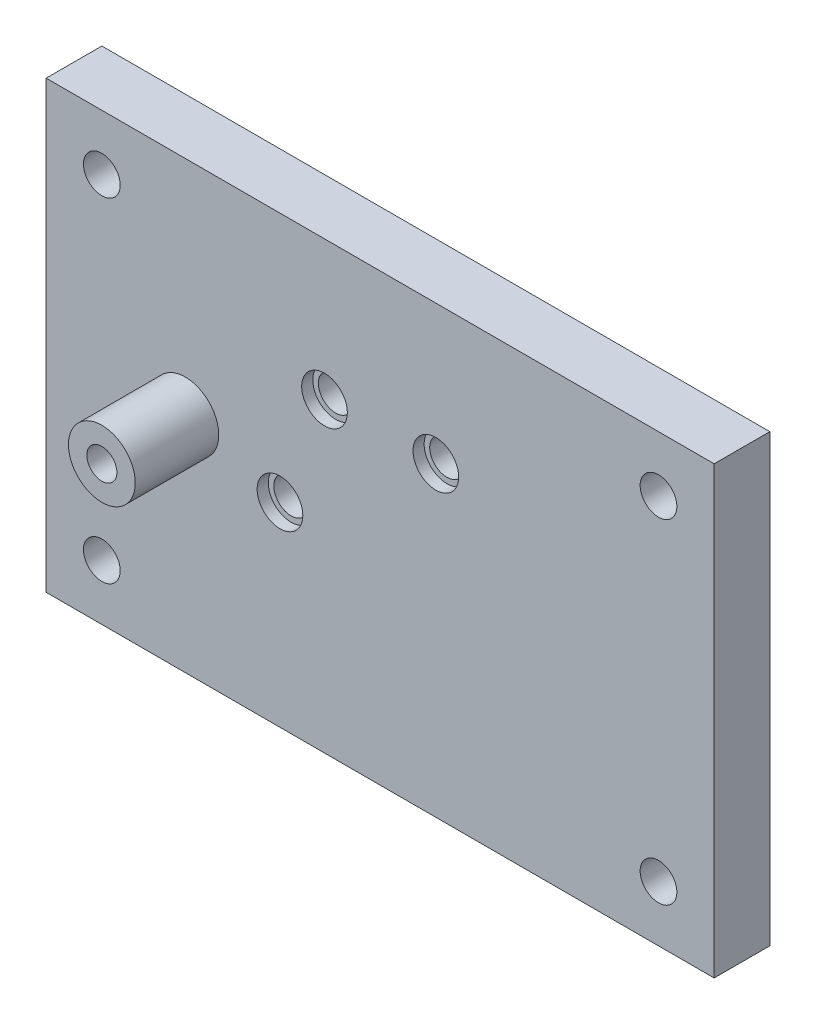
ISO-10303-21;
HEADER;
FILE_DESCRIPTION(('STEP AP214'),'2;1');
FILE_NAME('part.step','',(''),(''),'','','');
FILE_SCHEMA(('AUTOMOTIVE_DESIGN { 1 0 10303 214 1 1 1 1 }'));
ENDSEC;
DATA;
#1=APPLICATION_CONTEXT('core data for automotive mechanical design processes');
#2=APPLICATION_PROTOCOL_DEFINITION('international standard','automotive_design',2000,#1);
#3=PRODUCT_CONTEXT('',#1,'mechanical');
#4=PRODUCT('Part','Part','',(#3));
#5=PRODUCT_RELATED_PRODUCT_CATEGORY('part','',(#4));
#6=PRODUCT_DEFINITION_FORMATION('','',#4);
#7=PRODUCT_DEFINITION_CONTEXT('part definition',#1,'design');
#8=PRODUCT_DEFINITION('design','',#6,#7);
#9=PRODUCT_DEFINITION_SHAPE('','',#8);
#10=(LENGTH_UNIT() NAMED_UNIT(*) SI_UNIT(.MILLI.,.METRE.));
#11=(NAMED_UNIT(*) PLANE_ANGLE_UNIT() SI_UNIT($,.RADIAN.));
#12=(NAMED_UNIT(*) SI_UNIT($,.STERADIAN.) SOLID_ANGLE_UNIT());
#13=UNCERTAINTY_MEASURE_WITH_UNIT(LENGTH_MEASURE(1.E-05),#10,'distance_accuracy_value','');
#14=(GEOMETRIC_REPRESENTATION_CONTEXT(3) GLOBAL_UNCERTAINTY_ASSIGNED_CONTEXT((#13)) GLOBAL_UNIT_ASSIGNED_CONTEXT((#10,
#11,#12)) REPRESENTATION_CONTEXT('',''));
#15=CARTESIAN_POINT('',(0.,0.,0.));
#16=DIRECTION('',(0.,0.,1.));
#17=DIRECTION('',(1.,0.,0.));
#18=AXIS2_PLACEMENT_3D('',#15,#16,#17);
#19=CARTESIAN_POINT('',(-18.,-5.,10.));
#20=DIRECTION('',(0.,0.,-1.));
#21=DIRECTION('',(-1.,0.,0.));
#22=AXIS2_PLACEMENT_3D('',#19,#20,#21);
#23=CYLINDRICAL_SURFACE('',#22,3.1);
#24=CARTESIAN_POINT('',(-18.,-5.,0.));
#25=DIRECTION('',(0.,0.,1.));
#26=DIRECTION('',(1.,0.,0.));
#27=AXIS2_PLACEMENT_3D('',#24,#25,#26);
#28=CIRCLE('',#27,3.1);
#29=CARTESIAN_POINT('',(-14.9,-5.,0.));
#30=VERTEX_POINT('',#29);
#31=EDGE_CURVE('E120',#30,#30,#28,.T.);
#32=ORIENTED_EDGE('',*,*,#31,.F.);
#33=EDGE_LOOP('',(#32));
#34=FACE_BOUND('',#33,.T.);
#35=CARTESIAN_POINT('',(-18.,-5.,8.));
#36=DIRECTION('',(0.,0.,1.));
#37=DIRECTION('',(1.,0.,0.));
#38=AXIS2_PLACEMENT_3D('',#35,#36,#37);
#39=CIRCLE('',#38,3.1);
#40=CARTESIAN_POINT('',(-14.9,-5.,8.));
#41=VERTEX_POINT('',#40);
#42=EDGE_CURVE('E43',#41,#41,#39,.T.);
#43=ORIENTED_EDGE('',*,*,#42,.T.);
#44=EDGE_LOOP('',(#43));
#45=FACE_BOUND('',#44,.T.);
#46=ADVANCED_FACE('F39',(#34,#45),#23,.F.);
#47=CARTESIAN_POINT('',(10.,15.,10.));
#48=DIRECTION('',(0.,0.,-1.));
#49=DIRECTION('',(-1.,0.,0.));
#50=AXIS2_PLACEMENT_3D('',#47,#48,#49);
#51=CYLINDRICAL_SURFACE('',#50,3.1);
#52=CARTESIAN_POINT('',(10.,15.,0.));
#53=DIRECTION('',(0.,0.,1.));
#54=DIRECTION('',(1.,0.,0.));
#55=AXIS2_PLACEMENT_3D('',#52,#53,#54);
#56=CIRCLE('',#55,3.1);
#57=CARTESIAN_POINT('',(13.1,15.,0.));
#58=VERTEX_POINT('',#57);
#59=EDGE_CURVE('E145',#58,#58,#56,.T.);
#60=ORIENTED_EDGE('',*,*,#59,.F.);
#61=EDGE_LOOP('',(#60));
#62=FACE_BOUND('',#61,.T.);
#63=CARTESIAN_POINT('',(10.,15.,8.));
#64=DIRECTION('',(0.,0.,1.));
#65=DIRECTION('',(1.,0.,0.));
#66=AXIS2_PLACEMENT_3D('',#63,#64,#65);
#67=CIRCLE('',#66,3.1);
#68=CARTESIAN_POINT('',(13.1,15.,8.));
#69=VERTEX_POINT('',#68);
#70=EDGE_CURVE('E122',#69,#69,#67,.T.);
#71=ORIENTED_EDGE('',*,*,#70,.T.);
#72=EDGE_LOOP('',(#71));
#73=FACE_BOUND('',#72,.T.);
#74=ADVANCED_FACE('F184',(#62,#73),#51,.F.);
#75=CARTESIAN_POINT('',(-10.,15.,10.));
#76=DIRECTION('',(0.,0.,-1.));
#77=DIRECTION('',(-1.,0.,0.));
#78=AXIS2_PLACEMENT_3D('',#75,#76,#77);
#79=CYLINDRICAL_SURFACE('',#78,3.1);
#80=CARTESIAN_POINT('',(-10.,15.,0.));
#81=DIRECTION('',(0.,0.,1.));
#82=DIRECTION('',(1.,0.,0.));
#83=AXIS2_PLACEMENT_3D('',#80,#81,#82);
#84=CIRCLE('',#83,3.1);
#85=CARTESIAN_POINT('',(-6.9,15.,0.));
#86=VERTEX_POINT('',#85);
#87=EDGE_CURVE('E148',#86,#86,#84,.T.);
#88=ORIENTED_EDGE('',*,*,#87,.F.);
#89=EDGE_LOOP('',(#88));
#90=FACE_BOUND('',#89,.T.);
#91=CARTESIAN_POINT('',(-10.,15.,8.));
#92=DIRECTION('',(0.,0.,1.));
#93=DIRECTION('',(1.,0.,0.));
#94=AXIS2_PLACEMENT_3D('',#91,#92,#93);
#95=CIRCLE('',#94,3.1);
#96=CARTESIAN_POINT('',(-6.9,15.,8.));
#97=VERTEX_POINT('',#96);
#98=EDGE_CURVE('E118',#97,#97,#95,.T.);
#99=ORIENTED_EDGE('',*,*,#98,.T.);
#100=EDGE_LOOP('',(#99));
#101=FACE_BOUND('',#100,.T.);
#102=ADVANCED_FACE('F192',(#90,#101),#79,.F.);
#103=CARTESIAN_POINT('',(-60.,-40.,10.));
#104=DIRECTION('',(1.,0.,0.));
#105=DIRECTION('',(0.,0.,-1.));
#106=AXIS2_PLACEMENT_3D('',#103,#104,#105);
#107=PLANE('',#106);
#108=DIRECTION('',(0.,-1.,0.));
#109=VECTOR('',#108,1.);
#110=CARTESIAN_POINT('',(-60.,-40.,0.));
#111=LINE('',#110,#109);
#112=CARTESIAN_POINT('',(-60.,40.,0.));
#113=VERTEX_POINT('',#112);
#114=CARTESIAN_POINT('',(-60.,-40.,0.));
#115=VERTEX_POINT('',#114);
#116=EDGE_CURVE('E108',#113,#115,#111,.T.);
#117=ORIENTED_EDGE('',*,*,#116,.T.);
#118=DIRECTION('',(0.,0.,-1.));
#119=VECTOR('',#118,1.);
#120=CARTESIAN_POINT('',(-60.,-40.,10.));
#121=LINE('',#120,#119);
#122=CARTESIAN_POINT('',(-60.,-40.,10.));
#123=VERTEX_POINT('',#122);
#124=EDGE_CURVE('E49',#123,#115,#121,.T.);
#125=ORIENTED_EDGE('',*,*,#124,.F.);
#126=DIRECTION('',(0.,-1.,0.));
#127=VECTOR('',#126,1.);
#128=CARTESIAN_POINT('',(-60.,-40.,10.));
#129=LINE('',#128,#127);
#130=CARTESIAN_POINT('',(-60.,40.,10.));
#131=VERTEX_POINT('',#130);
#132=EDGE_CURVE('E94',#131,#123,#129,.T.);
#133=ORIENTED_EDGE('',*,*,#132,.F.);
#134=DIRECTION('',(0.,0.,-1.));
#135=VECTOR('',#134,1.);
#136=CARTESIAN_POINT('',(-60.,40.,10.));
#137=LINE('',#136,#135);
#138=EDGE_CURVE('E104',#131,#113,#137,.T.);
#139=ORIENTED_EDGE('',*,*,#138,.T.);
#140=EDGE_LOOP('',(#117,#125,#133,#139));
#141=FACE_BOUND('',#140,.T.);
#142=ADVANCED_FACE('F41',(#141),#107,.F.);
#143=CARTESIAN_POINT('',(-60.,-40.,10.));
#144=DIRECTION('',(0.,1.,0.));
#145=DIRECTION('',(0.,0.,1.));
#146=AXIS2_PLACEMENT_3D('',#143,#144,#145);
#147=PLANE('',#146);
#148=DIRECTION('',(1.,0.,0.));
#149=VECTOR('',#148,1.);
#150=CARTESIAN_POINT('',(-60.,-40.,0.));
#151=LINE('',#150,#149);
#152=CARTESIAN_POINT('',(60.,-40.,0.));
#153=VERTEX_POINT('',#152);
#154=EDGE_CURVE('E99',#115,#153,#151,.T.);
#155=ORIENTED_EDGE('',*,*,#154,.T.);
#156=DIRECTION('',(0.,0.,-1.));
#157=VECTOR('',#156,1.);
#158=CARTESIAN_POINT('',(60.,-40.,10.));
#159=LINE('',#158,#157);
#160=CARTESIAN_POINT('',(60.,-40.,10.));
#161=VERTEX_POINT('',#160);
#162=EDGE_CURVE('E97',#161,#153,#159,.T.);
#163=ORIENTED_EDGE('',*,*,#162,.F.);
#164=DIRECTION('',(1.,0.,0.));
#165=VECTOR('',#164,1.);
#166=CARTESIAN_POINT('',(-60.,-40.,10.));
#167=LINE('',#166,#165);
#168=EDGE_CURVE('E89',#123,#161,#167,.T.);
#169=ORIENTED_EDGE('',*,*,#168,.F.);
#170=ORIENTED_EDGE('',*,*,#124,.T.);
#171=EDGE_LOOP('',(#155,#163,#169,#170));
#172=FACE_BOUND('',#171,.T.);
#173=ADVANCED_FACE('F98',(#172),#147,.F.);
#174=CARTESIAN_POINT('',(60.,-40.,10.));
#175=DIRECTION('',(-1.,0.,0.));
#176=DIRECTION('',(0.,0.,1.));
#177=AXIS2_PLACEMENT_3D('',#174,#175,#176);
#178=PLANE('',#177);
#179=DIRECTION('',(0.,1.,0.));
#180=VECTOR('',#179,1.);
#181=CARTESIAN_POINT('',(60.,-40.,0.));
#182=LINE('',#181,#180);
#183=CARTESIAN_POINT('',(60.,40.,0.));
#184=VERTEX_POINT('',#183);
#185=EDGE_CURVE('E75',#153,#184,#182,.T.);
#186=ORIENTED_EDGE('',*,*,#185,.T.);
#187=DIRECTION('',(0.,0.,-1.));
#188=VECTOR('',#187,1.);
#189=CARTESIAN_POINT('',(60.,40.,10.));
#190=LINE('',#189,#188);
#191=CARTESIAN_POINT('',(60.,40.,10.));
#192=VERTEX_POINT('',#191);
#193=EDGE_CURVE('E100',#192,#184,#190,.T.);
#194=ORIENTED_EDGE('',*,*,#193,.F.);
#195=DIRECTION('',(0.,1.,0.));
#196=VECTOR('',#195,1.);
#197=CARTESIAN_POINT('',(60.,-40.,10.));
#198=LINE('',#197,#196);
#199=EDGE_CURVE('E92',#161,#192,#198,.T.);
#200=ORIENTED_EDGE('',*,*,#199,.F.);
#201=ORIENTED_EDGE('',*,*,#162,.T.);
#202=EDGE_LOOP('',(#186,#194,#200,#201));
#203=FACE_BOUND('',#202,.T.);
#204=ADVANCED_FACE('F102',(#203),#178,.F.);
#205=CARTESIAN_POINT('',(-60.,40.,10.));
#206=DIRECTION('',(0.,-1.,0.));
#207=DIRECTION('',(0.,0.,-1.));
#208=AXIS2_PLACEMENT_3D('',#205,#206,#207);
#209=PLANE('',#208);
#210=DIRECTION('',(-1.,0.,0.));
#211=VECTOR('',#210,1.);
#212=CARTESIAN_POINT('',(-60.,40.,0.));
#213=LINE('',#212,#211);
#214=EDGE_CURVE('E81',#184,#113,#213,.T.);
#215=ORIENTED_EDGE('',*,*,#214,.T.);
#216=ORIENTED_EDGE('',*,*,#138,.F.);
#217=DIRECTION('',(-1.,0.,0.));
#218=VECTOR('',#217,1.);
#219=CARTESIAN_POINT('',(-60.,40.,10.));
#220=LINE('',#219,#218);
#221=EDGE_CURVE('E58',#192,#131,#220,.T.);
#222=ORIENTED_EDGE('',*,*,#221,.F.);
#223=ORIENTED_EDGE('',*,*,#193,.T.);
#224=EDGE_LOOP('',(#215,#216,#222,#223));
#225=FACE_BOUND('',#224,.T.);
#226=ADVANCED_FACE('F170',(#225),#209,.F.);
#227=CARTESIAN_POINT('',(0.,0.,10.));
#228=DIRECTION('',(0.,0.,-1.));
#229=DIRECTION('',(-1.,0.,0.));
#230=AXIS2_PLACEMENT_3D('',#227,#228,#229);
#231=PLANE('',#230);
#232=CARTESIAN_POINT('',(50.,30.,10.));
#233=DIRECTION('',(0.,0.,1.));
#234=DIRECTION('',(1.,0.,0.));
#235=AXIS2_PLACEMENT_3D('',#232,#233,#234);
#236=CIRCLE('',#235,3.3);
#237=CARTESIAN_POINT('',(53.3,30.,10.));
#238=VERTEX_POINT('',#237);
#239=EDGE_CURVE('E367',#238,#238,#236,.T.);
#240=ORIENTED_EDGE('',*,*,#239,.F.);
#241=EDGE_LOOP('',(#240));
#242=FACE_BOUND('',#241,.T.);
#243=CARTESIAN_POINT('',(50.,-30.,10.));
#244=DIRECTION('',(0.,0.,1.));
#245=DIRECTION('',(1.,0.,0.));
#246=AXIS2_PLACEMENT_3D('',#243,#244,#245);
#247=CIRCLE('',#246,3.3);
#248=CARTESIAN_POINT('',(53.3,-30.,10.));
#249=VERTEX_POINT('',#248);
#250=EDGE_CURVE('E375',#249,#249,#247,.T.);
#251=ORIENTED_EDGE('',*,*,#250,.F.);
#252=EDGE_LOOP('',(#251));
#253=FACE_BOUND('',#252,.T.);
#254=CARTESIAN_POINT('',(-50.,30.,10.));
#255=DIRECTION('',(0.,0.,1.));
#256=DIRECTION('',(1.,0.,0.));
#257=AXIS2_PLACEMENT_3D('',#254,#255,#256);
#258=CIRCLE('',#257,3.3);
#259=CARTESIAN_POINT('',(-46.7,30.,10.));
#260=VERTEX_POINT('',#259);
#261=EDGE_CURVE('E381',#260,#260,#258,.T.);
#262=ORIENTED_EDGE('',*,*,#261,.F.);
#263=EDGE_LOOP('',(#262));
#264=FACE_BOUND('',#263,.T.);
#265=CARTESIAN_POINT('',(-50.,-30.,10.));
#266=DIRECTION('',(0.,0.,1.));
#267=DIRECTION('',(1.,0.,0.));
#268=AXIS2_PLACEMENT_3D('',#265,#266,#267);
#269=CIRCLE('',#268,3.3);
#270=CARTESIAN_POINT('',(-46.7,-30.,10.));
#271=VERTEX_POINT('',#270);
#272=EDGE_CURVE('E387',#271,#271,#269,.T.);
#273=ORIENTED_EDGE('',*,*,#272,.F.);
#274=EDGE_LOOP('',(#273));
#275=FACE_BOUND('',#274,.T.);
#276=CARTESIAN_POINT('',(-18.,-5.,10.));
#277=DIRECTION('',(0.,0.,1.));
#278=DIRECTION('',(1.,0.,0.));
#279=AXIS2_PLACEMENT_3D('',#276,#277,#278);
#280=CIRCLE('',#279,4.1);
#281=CARTESIAN_POINT('',(-13.9,-5.,10.));
#282=VERTEX_POINT('',#281);
#283=EDGE_CURVE('E391',#282,#282,#280,.T.);
#284=ORIENTED_EDGE('',*,*,#283,.F.);
#285=EDGE_LOOP('',(#284));
#286=FACE_BOUND('',#285,.T.);
#287=CARTESIAN_POINT('',(10.,15.,10.));
#288=DIRECTION('',(0.,0.,1.));
#289=DIRECTION('',(1.,0.,0.));
#290=AXIS2_PLACEMENT_3D('',#287,#288,#289);
#291=CIRCLE('',#290,4.1);
#292=CARTESIAN_POINT('',(14.1,15.,10.));
#293=VERTEX_POINT('',#292);
#294=EDGE_CURVE('E125',#293,#293,#291,.T.);
#295=ORIENTED_EDGE('',*,*,#294,.F.);
#296=EDGE_LOOP('',(#295));
#297=FACE_BOUND('',#296,.T.);
#298=CARTESIAN_POINT('',(-10.,15.,10.));
#299=DIRECTION('',(0.,0.,1.));
#300=DIRECTION('',(1.,0.,0.));
#301=AXIS2_PLACEMENT_3D('',#298,#299,#300);
#302=CIRCLE('',#301,4.1);
#303=CARTESIAN_POINT('',(-5.9,15.,10.));
#304=VERTEX_POINT('',#303);
#305=EDGE_CURVE('E121',#304,#304,#302,.T.);
#306=ORIENTED_EDGE('',*,*,#305,.F.);
#307=EDGE_LOOP('',(#306));
#308=FACE_BOUND('',#307,.T.);
#309=CARTESIAN_POINT('',(-35.,0.,10.));
#310=DIRECTION('',(0.,0.,-1.));
#311=DIRECTION('',(-1.,0.,0.));
#312=AXIS2_PLACEMENT_3D('',#309,#310,#311);
#313=CIRCLE('',#312,6.);
#314=CARTESIAN_POINT('',(-41.,0.,10.));
#315=VERTEX_POINT('',#314);
#316=EDGE_CURVE('E11',#315,#315,#313,.F.);
#317=ORIENTED_EDGE('',*,*,#316,.F.);
#318=EDGE_LOOP('',(#317));
#319=FACE_BOUND('',#318,.T.);
#320=ORIENTED_EDGE('',*,*,#132,.T.);
#321=ORIENTED_EDGE('',*,*,#168,.T.);
#322=ORIENTED_EDGE('',*,*,#199,.T.);
#323=ORIENTED_EDGE('',*,*,#221,.T.);
#324=EDGE_LOOP('',(#320,#321,#322,#323));
#325=FACE_BOUND('',#324,.T.);
#326=ADVANCED_FACE('F90',(#242,#253,#264,#275,#286,#297,#308,#319,#325),#231,.F.);
#327=CARTESIAN_POINT('',(0.,0.,0.));
#328=DIRECTION('',(0.,0.,-1.));
#329=DIRECTION('',(-1.,0.,0.));
#330=AXIS2_PLACEMENT_3D('',#327,#328,#329);
#331=PLANE('',#330);
#332=CARTESIAN_POINT('',(50.,30.,0.));
#333=DIRECTION('',(0.,0.,1.));
#334=DIRECTION('',(1.,0.,0.));
#335=AXIS2_PLACEMENT_3D('',#332,#333,#334);
#336=CIRCLE('',#335,3.3);
#337=CARTESIAN_POINT('',(53.3,30.,0.));
#338=VERTEX_POINT('',#337);
#339=EDGE_CURVE('E370',#338,#338,#336,.T.);
#340=ORIENTED_EDGE('',*,*,#339,.T.);
#341=EDGE_LOOP('',(#340));
#342=FACE_BOUND('',#341,.T.);
#343=CARTESIAN_POINT('',(50.,-30.,0.));
#344=DIRECTION('',(0.,0.,1.));
#345=DIRECTION('',(1.,0.,0.));
#346=AXIS2_PLACEMENT_3D('',#343,#344,#345);
#347=CIRCLE('',#346,3.3);
#348=CARTESIAN_POINT('',(53.3,-30.,0.));
#349=VERTEX_POINT('',#348);
#350=EDGE_CURVE('E372',#349,#349,#347,.T.);
#351=ORIENTED_EDGE('',*,*,#350,.T.);
#352=EDGE_LOOP('',(#351));
#353=FACE_BOUND('',#352,.T.);
#354=CARTESIAN_POINT('',(-50.,30.,0.));
#355=DIRECTION('',(0.,0.,1.));
#356=DIRECTION('',(1.,0.,0.));
#357=AXIS2_PLACEMENT_3D('',#354,#355,#356);
#358=CIRCLE('',#357,3.3);
#359=CARTESIAN_POINT('',(-46.7,30.,0.));
#360=VERTEX_POINT('',#359);
#361=EDGE_CURVE('E378',#360,#360,#358,.T.);
#362=ORIENTED_EDGE('',*,*,#361,.T.);
#363=EDGE_LOOP('',(#362));
#364=FACE_BOUND('',#363,.T.);
#365=CARTESIAN_POINT('',(-50.,-30.,0.));
#366=DIRECTION('',(0.,0.,1.));
#367=DIRECTION('',(1.,0.,0.));
#368=AXIS2_PLACEMENT_3D('',#365,#366,#367);
#369=CIRCLE('',#368,3.3);
#370=CARTESIAN_POINT('',(-46.7,-30.,0.));
#371=VERTEX_POINT('',#370);
#372=EDGE_CURVE('E384',#371,#371,#369,.T.);
#373=ORIENTED_EDGE('',*,*,#372,.T.);
#374=EDGE_LOOP('',(#373));
#375=FACE_BOUND('',#374,.T.);
#376=ORIENTED_EDGE('',*,*,#31,.T.);
#377=EDGE_LOOP('',(#376));
#378=FACE_BOUND('',#377,.T.);
#379=ORIENTED_EDGE('',*,*,#59,.T.);
#380=EDGE_LOOP('',(#379));
#381=FACE_BOUND('',#380,.T.);
#382=ORIENTED_EDGE('',*,*,#87,.T.);
#383=EDGE_LOOP('',(#382));
#384=FACE_BOUND('',#383,.T.);
#385=CARTESIAN_POINT('',(-35.,0.,0.));
#386=DIRECTION('',(0.,0.,1.));
#387=DIRECTION('',(1.,0.,0.));
#388=AXIS2_PLACEMENT_3D('',#385,#386,#387);
#389=CIRCLE('',#388,2.7);
#390=CARTESIAN_POINT('',(-32.3,0.,0.));
#391=VERTEX_POINT('',#390);
#392=EDGE_CURVE('E151',#391,#391,#389,.T.);
#393=ORIENTED_EDGE('',*,*,#392,.T.);
#394=EDGE_LOOP('',(#393));
#395=FACE_BOUND('',#394,.T.);
#396=ORIENTED_EDGE('',*,*,#116,.F.);
#397=ORIENTED_EDGE('',*,*,#214,.F.);
#398=ORIENTED_EDGE('',*,*,#185,.F.);
#399=ORIENTED_EDGE('',*,*,#154,.F.);
#400=EDGE_LOOP('',(#396,#397,#398,#399));
#401=FACE_BOUND('',#400,.T.);
#402=ADVANCED_FACE('F165',(#342,#353,#364,#375,#378,#381,#384,#395,#401),#331,.T.);
#403=CARTESIAN_POINT('',(-35.,0.,25.));
#404=DIRECTION('',(0.,0.,-1.));
#405=DIRECTION('',(-1.,0.,0.));
#406=AXIS2_PLACEMENT_3D('',#403,#404,#405);
#407=CYLINDRICAL_SURFACE('',#406,6.);
#408=CARTESIAN_POINT('',(-35.,0.,25.));
#409=DIRECTION('',(0.,0.,1.));
#410=DIRECTION('',(1.,0.,0.));
#411=AXIS2_PLACEMENT_3D('',#408,#409,#410);
#412=CIRCLE('',#411,6.);
#413=CARTESIAN_POINT('',(-29.,0.,25.));
#414=VERTEX_POINT('',#413);
#415=EDGE_CURVE('E111',#414,#414,#412,.T.);
#416=ORIENTED_EDGE('',*,*,#415,.F.);
#417=EDGE_LOOP('',(#416));
#418=FACE_BOUND('',#417,.T.);
#419=ORIENTED_EDGE('',*,*,#316,.T.);
#420=EDGE_LOOP('',(#419));
#421=FACE_BOUND('',#420,.T.);
#422=ADVANCED_FACE('F162',(#418,#421),#407,.T.);
#423=CARTESIAN_POINT('',(-35.,0.,25.));
#424=DIRECTION('',(0.,0.,1.));
#425=DIRECTION('',(1.,0.,0.));
#426=AXIS2_PLACEMENT_3D('',#423,#424,#425);
#427=PLANE('',#426);
#428=CARTESIAN_POINT('',(-35.,0.,25.));
#429=DIRECTION('',(0.,0.,1.));
#430=DIRECTION('',(1.,0.,0.));
#431=AXIS2_PLACEMENT_3D('',#428,#429,#430);
#432=CIRCLE('',#431,2.7);
#433=CARTESIAN_POINT('',(-32.3,0.,25.));
#434=VERTEX_POINT('',#433);
#435=EDGE_CURVE('E152',#434,#434,#432,.T.);
#436=ORIENTED_EDGE('',*,*,#435,.F.);
#437=EDGE_LOOP('',(#436));
#438=FACE_BOUND('',#437,.T.);
#439=ORIENTED_EDGE('',*,*,#415,.T.);
#440=EDGE_LOOP('',(#439));
#441=FACE_BOUND('',#440,.T.);
#442=ADVANCED_FACE('F160',(#438,#441),#427,.T.);
#443=CARTESIAN_POINT('',(-35.,0.,25.));
#444=DIRECTION('',(0.,0.,-1.));
#445=DIRECTION('',(-1.,0.,0.));
#446=AXIS2_PLACEMENT_3D('',#443,#444,#445);
#447=CYLINDRICAL_SURFACE('',#446,2.7);
#448=ORIENTED_EDGE('',*,*,#435,.T.);
#449=EDGE_LOOP('',(#448));
#450=FACE_BOUND('',#449,.T.);
#451=ORIENTED_EDGE('',*,*,#392,.F.);
#452=EDGE_LOOP('',(#451));
#453=FACE_BOUND('',#452,.T.);
#454=ADVANCED_FACE('F204',(#450,#453),#447,.F.);
#455=CARTESIAN_POINT('',(-10.,15.,10.));
#456=DIRECTION('',(0.,0.,-1.));
#457=DIRECTION('',(-1.,0.,0.));
#458=AXIS2_PLACEMENT_3D('',#455,#456,#457);
#459=CYLINDRICAL_SURFACE('',#458,4.1);
#460=ORIENTED_EDGE('',*,*,#305,.T.);
#461=EDGE_LOOP('',(#460));
#462=FACE_BOUND('',#461,.T.);
#463=CARTESIAN_POINT('',(-10.,15.,8.));
#464=DIRECTION('',(0.,0.,1.));
#465=DIRECTION('',(1.,0.,0.));
#466=AXIS2_PLACEMENT_3D('',#463,#464,#465);
#467=CIRCLE('',#466,4.1);
#468=CARTESIAN_POINT('',(-5.9,15.,8.));
#469=VERTEX_POINT('',#468);
#470=EDGE_CURVE('E124',#469,#469,#467,.T.);
#471=ORIENTED_EDGE('',*,*,#470,.F.);
#472=EDGE_LOOP('',(#471));
#473=FACE_BOUND('',#472,.T.);
#474=ADVANCED_FACE('F198',(#462,#473),#459,.F.);
#475=CARTESIAN_POINT('',(-10.,15.,8.));
#476=DIRECTION('',(0.,0.,1.));
#477=DIRECTION('',(1.,0.,0.));
#478=AXIS2_PLACEMENT_3D('',#475,#476,#477);
#479=PLANE('',#478);
#480=ORIENTED_EDGE('',*,*,#98,.F.);
#481=EDGE_LOOP('',(#480));
#482=FACE_BOUND('',#481,.T.);
#483=ORIENTED_EDGE('',*,*,#470,.T.);
#484=EDGE_LOOP('',(#483));
#485=FACE_BOUND('',#484,.T.);
#486=ADVANCED_FACE('F268',(#482,#485),#479,.T.);
#487=CARTESIAN_POINT('',(10.,15.,10.));
#488=DIRECTION('',(0.,0.,-1.));
#489=DIRECTION('',(-1.,0.,0.));
#490=AXIS2_PLACEMENT_3D('',#487,#488,#489);
#491=CYLINDRICAL_SURFACE('',#490,4.1);
#492=ORIENTED_EDGE('',*,*,#294,.T.);
#493=EDGE_LOOP('',(#492));
#494=FACE_BOUND('',#493,.T.);
#495=CARTESIAN_POINT('',(10.,15.,8.));
#496=DIRECTION('',(0.,0.,1.));
#497=DIRECTION('',(1.,0.,0.));
#498=AXIS2_PLACEMENT_3D('',#495,#496,#497);
#499=CIRCLE('',#498,4.1);
#500=CARTESIAN_POINT('',(14.1,15.,8.));
#501=VERTEX_POINT('',#500);
#502=EDGE_CURVE('E131',#501,#501,#499,.T.);
#503=ORIENTED_EDGE('',*,*,#502,.F.);
#504=EDGE_LOOP('',(#503));
#505=FACE_BOUND('',#504,.T.);
#506=ADVANCED_FACE('F277',(#494,#505),#491,.F.);
#507=CARTESIAN_POINT('',(10.,15.,8.));
#508=DIRECTION('',(0.,0.,1.));
#509=DIRECTION('',(1.,0.,0.));
#510=AXIS2_PLACEMENT_3D('',#507,#508,#509);
#511=PLANE('',#510);
#512=ORIENTED_EDGE('',*,*,#70,.F.);
#513=EDGE_LOOP('',(#512));
#514=FACE_BOUND('',#513,.T.);
#515=ORIENTED_EDGE('',*,*,#502,.T.);
#516=EDGE_LOOP('',(#515));
#517=FACE_BOUND('',#516,.T.);
#518=ADVANCED_FACE('F291',(#514,#517),#511,.T.);
#519=CARTESIAN_POINT('',(-18.,-5.,10.));
#520=DIRECTION('',(0.,0.,-1.));
#521=DIRECTION('',(-1.,0.,0.));
#522=AXIS2_PLACEMENT_3D('',#519,#520,#521);
#523=CYLINDRICAL_SURFACE('',#522,4.1);
#524=ORIENTED_EDGE('',*,*,#283,.T.);
#525=EDGE_LOOP('',(#524));
#526=FACE_BOUND('',#525,.T.);
#527=CARTESIAN_POINT('',(-18.,-5.,8.));
#528=DIRECTION('',(0.,0.,1.));
#529=DIRECTION('',(1.,0.,0.));
#530=AXIS2_PLACEMENT_3D('',#527,#528,#529);
#531=CIRCLE('',#530,4.1);
#532=CARTESIAN_POINT('',(-13.9,-5.,8.));
#533=VERTEX_POINT('',#532);
#534=EDGE_CURVE('E138',#533,#533,#531,.T.);
#535=ORIENTED_EDGE('',*,*,#534,.F.);
#536=EDGE_LOOP('',(#535));
#537=FACE_BOUND('',#536,.T.);
#538=ADVANCED_FACE('F299',(#526,#537),#523,.F.);
#539=CARTESIAN_POINT('',(-18.,-5.,8.));
#540=DIRECTION('',(0.,0.,1.));
#541=DIRECTION('',(1.,0.,0.));
#542=AXIS2_PLACEMENT_3D('',#539,#540,#541);
#543=PLANE('',#542);
#544=ORIENTED_EDGE('',*,*,#42,.F.);
#545=EDGE_LOOP('',(#544));
#546=FACE_BOUND('',#545,.T.);
#547=ORIENTED_EDGE('',*,*,#534,.T.);
#548=EDGE_LOOP('',(#547));
#549=FACE_BOUND('',#548,.T.);
#550=ADVANCED_FACE('F312',(#546,#549),#543,.T.);
#551=CARTESIAN_POINT('',(-50.,-30.,10.));
#552=DIRECTION('',(0.,0.,-1.));
#553=DIRECTION('',(-1.,0.,0.));
#554=AXIS2_PLACEMENT_3D('',#551,#552,#553);
#555=CYLINDRICAL_SURFACE('',#554,3.3);
#556=ORIENTED_EDGE('',*,*,#272,.T.);
#557=EDGE_LOOP('',(#556));
#558=FACE_BOUND('',#557,.T.);
#559=ORIENTED_EDGE('',*,*,#372,.F.);
#560=EDGE_LOOP('',(#559));
#561=FACE_BOUND('',#560,.T.);
#562=ADVANCED_FACE('F322',(#558,#561),#555,.F.);
#563=CARTESIAN_POINT('',(-50.,30.,10.));
#564=DIRECTION('',(0.,0.,-1.));
#565=DIRECTION('',(-1.,0.,0.));
#566=AXIS2_PLACEMENT_3D('',#563,#564,#565);
#567=CYLINDRICAL_SURFACE('',#566,3.3);
#568=ORIENTED_EDGE('',*,*,#261,.T.);
#569=EDGE_LOOP('',(#568));
#570=FACE_BOUND('',#569,.T.);
#571=ORIENTED_EDGE('',*,*,#361,.F.);
#572=EDGE_LOOP('',(#571));
#573=FACE_BOUND('',#572,.T.);
#574=ADVANCED_FACE('F332',(#570,#573),#567,.F.);
#575=CARTESIAN_POINT('',(50.,-30.,10.));
#576=DIRECTION('',(0.,0.,-1.));
#577=DIRECTION('',(-1.,0.,0.));
#578=AXIS2_PLACEMENT_3D('',#575,#576,#577);
#579=CYLINDRICAL_SURFACE('',#578,3.3);
#580=ORIENTED_EDGE('',*,*,#250,.T.);
#581=EDGE_LOOP('',(#580));
#582=FACE_BOUND('',#581,.T.);
#583=ORIENTED_EDGE('',*,*,#350,.F.);
#584=EDGE_LOOP('',(#583));
#585=FACE_BOUND('',#584,.T.);
#586=ADVANCED_FACE('F342',(#582,#585),#579,.F.);
#587=CARTESIAN_POINT('',(50.,30.,10.));
#588=DIRECTION('',(0.,0.,-1.));
#589=DIRECTION('',(-1.,0.,0.));
#590=AXIS2_PLACEMENT_3D('',#587,#588,#589);
#591=CYLINDRICAL_SURFACE('',#590,3.3);
#592=ORIENTED_EDGE('',*,*,#239,.T.);
#593=EDGE_LOOP('',(#592));
#594=FACE_BOUND('',#593,.T.);
#595=ORIENTED_EDGE('',*,*,#339,.F.);
#596=EDGE_LOOP('',(#595));
#597=FACE_BOUND('',#596,.T.);
#598=ADVANCED_FACE('F351',(#594,#597),#591,.F.);
#599=CLOSED_SHELL('',(#46,#74,#102,#142,#173,#204,#226,#326,#402,#422,#442,#454,#474,#486,#506,
#518,#538,#550,#562,#574,#586,#598));
#600=MANIFOLD_SOLID_BREP('B2',#599);
#601=ADVANCED_BREP_SHAPE_REPRESENTATION('',(#18,#600),#14);
#602=SHAPE_DEFINITION_REPRESENTATION(#9,#601);
ENDSEC;
END-ISO-10303-21;
